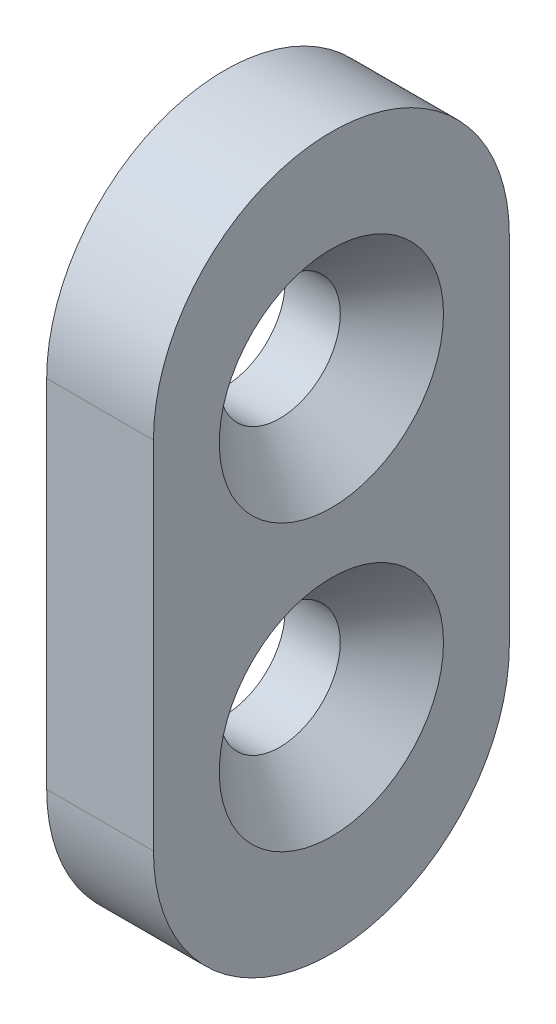
ISO-10303-21;
HEADER;
FILE_DESCRIPTION(('STEP AP214'),'2;1');
FILE_NAME('part.step','',(''),(''),'','','');
FILE_SCHEMA(('AUTOMOTIVE_DESIGN { 1 0 10303 214 1 1 1 1 }'));
ENDSEC;
DATA;
#1=APPLICATION_CONTEXT('core data for automotive mechanical design processes');
#2=APPLICATION_PROTOCOL_DEFINITION('international standard','automotive_design',2000,#1);
#3=PRODUCT_CONTEXT('',#1,'mechanical');
#4=PRODUCT('Part','Part','',(#3));
#5=PRODUCT_RELATED_PRODUCT_CATEGORY('part','',(#4));
#6=PRODUCT_DEFINITION_FORMATION('','',#4);
#7=PRODUCT_DEFINITION_CONTEXT('part definition',#1,'design');
#8=PRODUCT_DEFINITION('design','',#6,#7);
#9=PRODUCT_DEFINITION_SHAPE('','',#8);
#10=(LENGTH_UNIT() NAMED_UNIT(*) SI_UNIT(.MILLI.,.METRE.));
#11=(NAMED_UNIT(*) PLANE_ANGLE_UNIT() SI_UNIT($,.RADIAN.));
#12=(NAMED_UNIT(*) SI_UNIT($,.STERADIAN.) SOLID_ANGLE_UNIT());
#13=UNCERTAINTY_MEASURE_WITH_UNIT(LENGTH_MEASURE(1.E-05),#10,'distance_accuracy_value','');
#14=(GEOMETRIC_REPRESENTATION_CONTEXT(3) GLOBAL_UNCERTAINTY_ASSIGNED_CONTEXT((#13)) GLOBAL_UNIT_ASSIGNED_CONTEXT((#10,
#11,#12)) REPRESENTATION_CONTEXT('',''));
#15=CARTESIAN_POINT('',(0.,0.,0.));
#16=DIRECTION('',(0.,0.,1.));
#17=DIRECTION('',(1.,0.,0.));
#18=AXIS2_PLACEMENT_3D('',#15,#16,#17);
#19=CARTESIAN_POINT('',(1.5,5.,0.));
#20=DIRECTION('',(-1.,0.,0.));
#21=DIRECTION('',(0.,0.,1.));
#22=AXIS2_PLACEMENT_3D('',#19,#20,#21);
#23=CYLINDRICAL_SURFACE('',#22,5.);
#24=CARTESIAN_POINT('',(-1.5,5.,0.));
#25=DIRECTION('',(1.,0.,0.));
#26=DIRECTION('',(0.,0.,-1.));
#27=AXIS2_PLACEMENT_3D('',#24,#25,#26);
#28=CIRCLE('',#27,5.);
#29=CARTESIAN_POINT('',(-1.5,5.,-5.));
#30=VERTEX_POINT('',#29);
#31=CARTESIAN_POINT('',(-1.5,5.,5.));
#32=VERTEX_POINT('',#31);
#33=EDGE_CURVE('E99',#30,#32,#28,.T.);
#34=ORIENTED_EDGE('',*,*,#33,.T.);
#35=DIRECTION('',(-1.,0.,0.));
#36=VECTOR('',#35,1.);
#37=CARTESIAN_POINT('',(1.5,5.,5.));
#38=LINE('',#37,#36);
#39=CARTESIAN_POINT('',(1.5,5.,5.));
#40=VERTEX_POINT('',#39);
#41=EDGE_CURVE('E11',#40,#32,#38,.T.);
#42=ORIENTED_EDGE('',*,*,#41,.F.);
#43=CARTESIAN_POINT('',(1.5,5.,0.));
#44=DIRECTION('',(1.,0.,0.));
#45=DIRECTION('',(0.,0.,-1.));
#46=AXIS2_PLACEMENT_3D('',#43,#44,#45);
#47=CIRCLE('',#46,5.);
#48=CARTESIAN_POINT('',(1.5,5.,-5.));
#49=VERTEX_POINT('',#48);
#50=EDGE_CURVE('E87',#49,#40,#47,.T.);
#51=ORIENTED_EDGE('',*,*,#50,.F.);
#52=DIRECTION('',(-1.,0.,0.));
#53=VECTOR('',#52,1.);
#54=CARTESIAN_POINT('',(1.5,5.,-5.));
#55=LINE('',#54,#53);
#56=EDGE_CURVE('E95',#49,#30,#55,.T.);
#57=ORIENTED_EDGE('',*,*,#56,.T.);
#58=EDGE_LOOP('',(#34,#42,#51,#57));
#59=FACE_BOUND('',#58,.T.);
#60=ADVANCED_FACE('F36',(#59),#23,.T.);
#61=CARTESIAN_POINT('',(1.5,5.,5.));
#62=DIRECTION('',(0.,0.,-1.));
#63=DIRECTION('',(0.,1.,0.));
#64=AXIS2_PLACEMENT_3D('',#61,#62,#63);
#65=PLANE('',#64);
#66=DIRECTION('',(0.,-1.,0.));
#67=VECTOR('',#66,1.);
#68=CARTESIAN_POINT('',(-1.5,5.,5.));
#69=LINE('',#68,#67);
#70=CARTESIAN_POINT('',(-1.5,-5.,5.));
#71=VERTEX_POINT('',#70);
#72=EDGE_CURVE('E91',#32,#71,#69,.T.);
#73=ORIENTED_EDGE('',*,*,#72,.T.);
#74=DIRECTION('',(-1.,0.,0.));
#75=VECTOR('',#74,1.);
#76=CARTESIAN_POINT('',(1.5,-5.,5.));
#77=LINE('',#76,#75);
#78=CARTESIAN_POINT('',(1.5,-5.,5.));
#79=VERTEX_POINT('',#78);
#80=EDGE_CURVE('E44',#79,#71,#77,.T.);
#81=ORIENTED_EDGE('',*,*,#80,.F.);
#82=DIRECTION('',(0.,-1.,0.));
#83=VECTOR('',#82,1.);
#84=CARTESIAN_POINT('',(1.5,5.,5.));
#85=LINE('',#84,#83);
#86=EDGE_CURVE('E82',#40,#79,#85,.T.);
#87=ORIENTED_EDGE('',*,*,#86,.F.);
#88=ORIENTED_EDGE('',*,*,#41,.T.);
#89=EDGE_LOOP('',(#73,#81,#87,#88));
#90=FACE_BOUND('',#89,.T.);
#91=ADVANCED_FACE('F90',(#90),#65,.F.);
#92=CARTESIAN_POINT('',(1.5,-5.,0.));
#93=DIRECTION('',(-1.,0.,0.));
#94=DIRECTION('',(0.,0.,1.));
#95=AXIS2_PLACEMENT_3D('',#92,#93,#94);
#96=CYLINDRICAL_SURFACE('',#95,5.);
#97=CARTESIAN_POINT('',(-1.5,-5.,0.));
#98=DIRECTION('',(1.,0.,0.));
#99=DIRECTION('',(0.,0.,-1.));
#100=AXIS2_PLACEMENT_3D('',#97,#98,#99);
#101=CIRCLE('',#100,5.);
#102=CARTESIAN_POINT('',(-1.5,-5.,-5.));
#103=VERTEX_POINT('',#102);
#104=EDGE_CURVE('E69',#71,#103,#101,.T.);
#105=ORIENTED_EDGE('',*,*,#104,.T.);
#106=DIRECTION('',(-1.,0.,0.));
#107=VECTOR('',#106,1.);
#108=CARTESIAN_POINT('',(1.5,-5.,-5.));
#109=LINE('',#108,#107);
#110=CARTESIAN_POINT('',(1.5,-5.,-5.));
#111=VERTEX_POINT('',#110);
#112=EDGE_CURVE('E92',#111,#103,#109,.T.);
#113=ORIENTED_EDGE('',*,*,#112,.F.);
#114=CARTESIAN_POINT('',(1.5,-5.,0.));
#115=DIRECTION('',(1.,0.,0.));
#116=DIRECTION('',(0.,0.,-1.));
#117=AXIS2_PLACEMENT_3D('',#114,#115,#116);
#118=CIRCLE('',#117,5.);
#119=EDGE_CURVE('E85',#79,#111,#118,.T.);
#120=ORIENTED_EDGE('',*,*,#119,.F.);
#121=ORIENTED_EDGE('',*,*,#80,.T.);
#122=EDGE_LOOP('',(#105,#113,#120,#121));
#123=FACE_BOUND('',#122,.T.);
#124=ADVANCED_FACE('F93',(#123),#96,.T.);
#125=CARTESIAN_POINT('',(1.5,5.,-5.));
#126=DIRECTION('',(0.,0.,1.));
#127=DIRECTION('',(0.,-1.,0.));
#128=AXIS2_PLACEMENT_3D('',#125,#126,#127);
#129=PLANE('',#128);
#130=DIRECTION('',(0.,1.,0.));
#131=VECTOR('',#130,1.);
#132=CARTESIAN_POINT('',(-1.5,5.,-5.));
#133=LINE('',#132,#131);
#134=EDGE_CURVE('E75',#103,#30,#133,.T.);
#135=ORIENTED_EDGE('',*,*,#134,.T.);
#136=ORIENTED_EDGE('',*,*,#56,.F.);
#137=DIRECTION('',(0.,1.,0.));
#138=VECTOR('',#137,1.);
#139=CARTESIAN_POINT('',(1.5,5.,-5.));
#140=LINE('',#139,#138);
#141=EDGE_CURVE('E52',#111,#49,#140,.T.);
#142=ORIENTED_EDGE('',*,*,#141,.F.);
#143=ORIENTED_EDGE('',*,*,#112,.T.);
#144=EDGE_LOOP('',(#135,#136,#142,#143));
#145=FACE_BOUND('',#144,.T.);
#146=ADVANCED_FACE('F107',(#145),#129,.F.);
#147=CARTESIAN_POINT('',(1.5,5.,0.));
#148=DIRECTION('',(1.,0.,0.));
#149=DIRECTION('',(0.,0.,-1.));
#150=AXIS2_PLACEMENT_3D('',#147,#148,#149);
#151=PLANE('',#150);
#152=CARTESIAN_POINT('',(1.5,4.,0.));
#153=DIRECTION('',(1.,0.,0.));
#154=DIRECTION('',(0.,0.,-1.));
#155=AXIS2_PLACEMENT_3D('',#152,#153,#154);
#156=CIRCLE('',#155,3.15);
#157=CARTESIAN_POINT('',(1.5,4.,-3.14999999999997));
#158=VERTEX_POINT('',#157);
#159=EDGE_CURVE('E127',#158,#158,#156,.T.);
#160=ORIENTED_EDGE('',*,*,#159,.F.);
#161=EDGE_LOOP('',(#160));
#162=FACE_BOUND('',#161,.T.);
#163=CARTESIAN_POINT('',(1.5,-4.,0.));
#164=DIRECTION('',(1.,0.,0.));
#165=DIRECTION('',(0.,0.,-1.));
#166=AXIS2_PLACEMENT_3D('',#163,#164,#165);
#167=CIRCLE('',#166,3.15);
#168=CARTESIAN_POINT('',(1.5,-4.,-3.15000000000003));
#169=VERTEX_POINT('',#168);
#170=EDGE_CURVE('E118',#169,#169,#167,.T.);
#171=ORIENTED_EDGE('',*,*,#170,.F.);
#172=EDGE_LOOP('',(#171));
#173=FACE_BOUND('',#172,.T.);
#174=ORIENTED_EDGE('',*,*,#50,.T.);
#175=ORIENTED_EDGE('',*,*,#86,.T.);
#176=ORIENTED_EDGE('',*,*,#119,.T.);
#177=ORIENTED_EDGE('',*,*,#141,.T.);
#178=EDGE_LOOP('',(#174,#175,#176,#177));
#179=FACE_BOUND('',#178,.T.);
#180=ADVANCED_FACE('F83',(#162,#173,#179),#151,.T.);
#181=CARTESIAN_POINT('',(-1.5,5.,0.));
#182=DIRECTION('',(1.,0.,0.));
#183=DIRECTION('',(0.,0.,-1.));
#184=AXIS2_PLACEMENT_3D('',#181,#182,#183);
#185=PLANE('',#184);
#186=CARTESIAN_POINT('',(-1.5,4.,0.));
#187=DIRECTION('',(1.,0.,0.));
#188=DIRECTION('',(0.,0.,-1.));
#189=AXIS2_PLACEMENT_3D('',#186,#187,#188);
#190=CIRCLE('',#189,1.7);
#191=CARTESIAN_POINT('',(-1.5,4.,-1.69999999999997));
#192=VERTEX_POINT('',#191);
#193=EDGE_CURVE('E121',#192,#192,#190,.T.);
#194=ORIENTED_EDGE('',*,*,#193,.T.);
#195=EDGE_LOOP('',(#194));
#196=FACE_BOUND('',#195,.T.);
#197=CARTESIAN_POINT('',(-1.5,-4.,0.));
#198=DIRECTION('',(1.,0.,0.));
#199=DIRECTION('',(0.,0.,-1.));
#200=AXIS2_PLACEMENT_3D('',#197,#198,#199);
#201=CIRCLE('',#200,1.7);
#202=CARTESIAN_POINT('',(-1.5,-4.,-1.70000000000003));
#203=VERTEX_POINT('',#202);
#204=EDGE_CURVE('E102',#203,#203,#201,.T.);
#205=ORIENTED_EDGE('',*,*,#204,.T.);
#206=EDGE_LOOP('',(#205));
#207=FACE_BOUND('',#206,.T.);
#208=ORIENTED_EDGE('',*,*,#33,.F.);
#209=ORIENTED_EDGE('',*,*,#134,.F.);
#210=ORIENTED_EDGE('',*,*,#104,.F.);
#211=ORIENTED_EDGE('',*,*,#72,.F.);
#212=EDGE_LOOP('',(#208,#209,#210,#211));
#213=FACE_BOUND('',#212,.T.);
#214=ADVANCED_FACE('F110',(#196,#207,#213),#185,.F.);
#215=CARTESIAN_POINT('',(1.5,-4.,0.));
#216=DIRECTION('',(1.,0.,0.));
#217=DIRECTION('',(0.,0.,-1.));
#218=AXIS2_PLACEMENT_3D('',#215,#216,#217);
#219=CYLINDRICAL_SURFACE('',#218,1.7);
#220=ORIENTED_EDGE('',*,*,#204,.F.);
#221=EDGE_LOOP('',(#220));
#222=FACE_BOUND('',#221,.T.);
#223=CARTESIAN_POINT('',(0.0499999999999997,-4.,0.));
#224=DIRECTION('',(1.,0.,0.));
#225=DIRECTION('',(0.,0.,-1.));
#226=AXIS2_PLACEMENT_3D('',#223,#224,#225);
#227=CIRCLE('',#226,1.7);
#228=CARTESIAN_POINT('',(0.0499999999999997,-4.,-1.70000000000003));
#229=VERTEX_POINT('',#228);
#230=EDGE_CURVE('E115',#229,#229,#227,.T.);
#231=ORIENTED_EDGE('',*,*,#230,.T.);
#232=EDGE_LOOP('',(#231));
#233=FACE_BOUND('',#232,.T.);
#234=ADVANCED_FACE('F141',(#222,#233),#219,.F.);
#235=CARTESIAN_POINT('',(1.5,-4.,0.));
#236=DIRECTION('',(1.,0.,0.));
#237=DIRECTION('',(0.,0.,-1.));
#238=AXIS2_PLACEMENT_3D('',#235,#236,#237);
#239=CONICAL_SURFACE('',#238,3.15,0.785398163397448);
#240=ORIENTED_EDGE('',*,*,#230,.F.);
#241=EDGE_LOOP('',(#240));
#242=FACE_BOUND('',#241,.T.);
#243=ORIENTED_EDGE('',*,*,#170,.T.);
#244=EDGE_LOOP('',(#243));
#245=FACE_BOUND('',#244,.T.);
#246=ADVANCED_FACE('F138',(#242,#245),#239,.F.);
#247=CARTESIAN_POINT('',(1.5,4.,0.));
#248=DIRECTION('',(1.,0.,0.));
#249=DIRECTION('',(0.,0.,-1.));
#250=AXIS2_PLACEMENT_3D('',#247,#248,#249);
#251=CYLINDRICAL_SURFACE('',#250,1.7);
#252=ORIENTED_EDGE('',*,*,#193,.F.);
#253=EDGE_LOOP('',(#252));
#254=FACE_BOUND('',#253,.T.);
#255=CARTESIAN_POINT('',(0.0499999999999997,4.,0.));
#256=DIRECTION('',(1.,0.,0.));
#257=DIRECTION('',(0.,0.,-1.));
#258=AXIS2_PLACEMENT_3D('',#255,#256,#257);
#259=CIRCLE('',#258,1.7);
#260=CARTESIAN_POINT('',(0.0499999999999997,4.,-1.69999999999997));
#261=VERTEX_POINT('',#260);
#262=EDGE_CURVE('E124',#261,#261,#259,.T.);
#263=ORIENTED_EDGE('',*,*,#262,.T.);
#264=EDGE_LOOP('',(#263));
#265=FACE_BOUND('',#264,.T.);
#266=ADVANCED_FACE('F140',(#254,#265),#251,.F.);
#267=CARTESIAN_POINT('',(1.5,4.,0.));
#268=DIRECTION('',(1.,0.,0.));
#269=DIRECTION('',(0.,0.,-1.));
#270=AXIS2_PLACEMENT_3D('',#267,#268,#269);
#271=CONICAL_SURFACE('',#270,3.15,0.785398163397448);
#272=ORIENTED_EDGE('',*,*,#262,.F.);
#273=EDGE_LOOP('',(#272));
#274=FACE_BOUND('',#273,.T.);
#275=ORIENTED_EDGE('',*,*,#159,.T.);
#276=EDGE_LOOP('',(#275));
#277=FACE_BOUND('',#276,.T.);
#278=ADVANCED_FACE('F131',(#274,#277),#271,.F.);
#279=CLOSED_SHELL('',(#60,#91,#124,#146,#180,#214,#234,#246,#266,#278));
#280=MANIFOLD_SOLID_BREP('B2',#279);
#281=ADVANCED_BREP_SHAPE_REPRESENTATION('',(#18,#280),#14);
#282=SHAPE_DEFINITION_REPRESENTATION(#9,#281);
ENDSEC;
END-ISO-10303-21;
